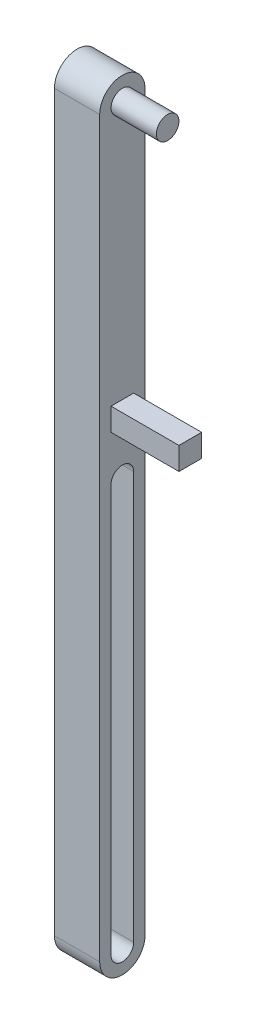
ISO-10303-21;
HEADER;
FILE_DESCRIPTION(('STEP AP214'),'2;1');
FILE_NAME('part.step','',(''),(''),'','','');
FILE_SCHEMA(('AUTOMOTIVE_DESIGN { 1 0 10303 214 1 1 1 1 }'));
ENDSEC;
DATA;
#1=APPLICATION_CONTEXT('core data for automotive mechanical design processes');
#2=APPLICATION_PROTOCOL_DEFINITION('international standard','automotive_design',2000,#1);
#3=PRODUCT_CONTEXT('',#1,'mechanical');
#4=PRODUCT('Part','Part','',(#3));
#5=PRODUCT_RELATED_PRODUCT_CATEGORY('part','',(#4));
#6=PRODUCT_DEFINITION_FORMATION('','',#4);
#7=PRODUCT_DEFINITION_CONTEXT('part definition',#1,'design');
#8=PRODUCT_DEFINITION('design','',#6,#7);
#9=PRODUCT_DEFINITION_SHAPE('','',#8);
#10=(LENGTH_UNIT() NAMED_UNIT(*) SI_UNIT(.MILLI.,.METRE.));
#11=(NAMED_UNIT(*) PLANE_ANGLE_UNIT() SI_UNIT($,.RADIAN.));
#12=(NAMED_UNIT(*) SI_UNIT($,.STERADIAN.) SOLID_ANGLE_UNIT());
#13=UNCERTAINTY_MEASURE_WITH_UNIT(LENGTH_MEASURE(1.E-05),#10,'distance_accuracy_value','');
#14=(GEOMETRIC_REPRESENTATION_CONTEXT(3) GLOBAL_UNCERTAINTY_ASSIGNED_CONTEXT((#13)) GLOBAL_UNIT_ASSIGNED_CONTEXT((#10,
#11,#12)) REPRESENTATION_CONTEXT('',''));
#15=CARTESIAN_POINT('',(0.,0.,0.));
#16=DIRECTION('',(0.,0.,1.));
#17=DIRECTION('',(1.,0.,0.));
#18=AXIS2_PLACEMENT_3D('',#15,#16,#17);
#19=CARTESIAN_POINT('',(-12.,0.,-236.412295168564));
#20=DIRECTION('',(0.,0.,1.));
#21=DIRECTION('',(1.,0.,0.));
#22=AXIS2_PLACEMENT_3D('',#19,#20,#21);
#23=PLANE('',#22);
#24=DIRECTION('',(0.,-1.,0.));
#25=VECTOR('',#24,1.);
#26=CARTESIAN_POINT('',(-3.99999999999999,0.,-236.412295168564));
#27=LINE('',#26,#25);
#28=CARTESIAN_POINT('',(-3.99999999999999,-131.821024249135,-236.412295168564));
#29=VERTEX_POINT('',#28);
#30=CARTESIAN_POINT('',(-3.99999999999999,-261.443240014958,-236.412295168564));
#31=VERTEX_POINT('',#30);
#32=EDGE_CURVE('E159',#29,#31,#27,.T.);
#33=ORIENTED_EDGE('',*,*,#32,.T.);
#34=DIRECTION('',(1.,0.,0.));
#35=VECTOR('',#34,1.);
#36=CARTESIAN_POINT('',(-12.,-261.443240014958,-236.412295168564));
#37=LINE('',#36,#35);
#38=CARTESIAN_POINT('',(-12.,-261.443240014958,-236.412295168564));
#39=VERTEX_POINT('',#38);
#40=EDGE_CURVE('E45',#39,#31,#37,.T.);
#41=ORIENTED_EDGE('',*,*,#40,.F.);
#42=DIRECTION('',(0.,-1.,0.));
#43=VECTOR('',#42,1.);
#44=CARTESIAN_POINT('',(-12.,0.,-236.412295168564));
#45=LINE('',#44,#43);
#46=CARTESIAN_POINT('',(-12.,-131.821024249135,-236.412295168564));
#47=VERTEX_POINT('',#46);
#48=EDGE_CURVE('E126',#47,#39,#45,.T.);
#49=ORIENTED_EDGE('',*,*,#48,.F.);
#50=DIRECTION('',(1.,0.,0.));
#51=VECTOR('',#50,1.);
#52=CARTESIAN_POINT('',(-12.,-131.821024249135,-236.412295168564));
#53=LINE('',#52,#51);
#54=EDGE_CURVE('E61',#47,#29,#53,.T.);
#55=ORIENTED_EDGE('',*,*,#54,.T.);
#56=EDGE_LOOP('',(#33,#41,#49,#55));
#57=FACE_BOUND('',#56,.T.);
#58=ADVANCED_FACE('F37',(#57),#23,.F.);
#59=CARTESIAN_POINT('',(-12.,-261.443240014958,-232.412295168564));
#60=DIRECTION('',(1.,0.,0.));
#61=DIRECTION('',(0.,0.,-1.));
#62=AXIS2_PLACEMENT_3D('',#59,#60,#61);
#63=CYLINDRICAL_SURFACE('',#62,4.);
#64=CARTESIAN_POINT('',(-3.99999999999999,-261.443240014958,-232.412295168564));
#65=DIRECTION('',(-1.,0.,0.));
#66=DIRECTION('',(0.,0.,1.));
#67=AXIS2_PLACEMENT_3D('',#64,#65,#66);
#68=CIRCLE('',#67,4.);
#69=CARTESIAN_POINT('',(-3.99999999999999,-261.443240014958,-228.412295168564));
#70=VERTEX_POINT('',#69);
#71=EDGE_CURVE('E134',#31,#70,#68,.T.);
#72=ORIENTED_EDGE('',*,*,#71,.T.);
#73=DIRECTION('',(1.,0.,0.));
#74=VECTOR('',#73,1.);
#75=CARTESIAN_POINT('',(-12.,-261.443240014958,-228.412295168564));
#76=LINE('',#75,#74);
#77=CARTESIAN_POINT('',(-12.,-261.443240014958,-228.412295168564));
#78=VERTEX_POINT('',#77);
#79=EDGE_CURVE('E132',#78,#70,#76,.T.);
#80=ORIENTED_EDGE('',*,*,#79,.F.);
#81=CARTESIAN_POINT('',(-12.,-261.443240014958,-232.412295168564));
#82=DIRECTION('',(-1.,0.,0.));
#83=DIRECTION('',(0.,0.,1.));
#84=AXIS2_PLACEMENT_3D('',#81,#82,#83);
#85=CIRCLE('',#84,4.);
#86=EDGE_CURVE('E120',#39,#78,#85,.T.);
#87=ORIENTED_EDGE('',*,*,#86,.F.);
#88=ORIENTED_EDGE('',*,*,#40,.T.);
#89=EDGE_LOOP('',(#72,#80,#87,#88));
#90=FACE_BOUND('',#89,.T.);
#91=ADVANCED_FACE('F133',(#90),#63,.T.);
#92=CARTESIAN_POINT('',(-12.,0.,-228.412295168564));
#93=DIRECTION('',(0.,0.,1.));
#94=DIRECTION('',(1.,0.,0.));
#95=AXIS2_PLACEMENT_3D('',#92,#93,#94);
#96=PLANE('',#95);
#97=DIRECTION('',(0.,-1.,0.));
#98=VECTOR('',#97,1.);
#99=CARTESIAN_POINT('',(-3.99999999999999,0.,-228.412295168564));
#100=LINE('',#99,#98);
#101=CARTESIAN_POINT('',(-3.99999999999999,-131.821024249135,-228.412295168564));
#102=VERTEX_POINT('',#101);
#103=EDGE_CURVE('E162',#102,#70,#100,.T.);
#104=ORIENTED_EDGE('',*,*,#103,.F.);
#105=DIRECTION('',(1.,0.,0.));
#106=VECTOR('',#105,1.);
#107=CARTESIAN_POINT('',(-12.,-131.821024249135,-228.412295168564));
#108=LINE('',#107,#106);
#109=CARTESIAN_POINT('',(-12.,-131.821024249135,-228.412295168564));
#110=VERTEX_POINT('',#109);
#111=EDGE_CURVE('E138',#110,#102,#108,.T.);
#112=ORIENTED_EDGE('',*,*,#111,.F.);
#113=DIRECTION('',(0.,-1.,0.));
#114=VECTOR('',#113,1.);
#115=CARTESIAN_POINT('',(-12.,0.,-228.412295168564));
#116=LINE('',#115,#114);
#117=EDGE_CURVE('E125',#110,#78,#116,.T.);
#118=ORIENTED_EDGE('',*,*,#117,.T.);
#119=ORIENTED_EDGE('',*,*,#79,.T.);
#120=EDGE_LOOP('',(#104,#112,#118,#119));
#121=FACE_BOUND('',#120,.T.);
#122=ADVANCED_FACE('F140',(#121),#96,.T.);
#123=CARTESIAN_POINT('',(-12.,-261.443240014958,-232.412295168564));
#124=DIRECTION('',(1.,0.,0.));
#125=DIRECTION('',(0.,0.,-1.));
#126=AXIS2_PLACEMENT_3D('',#123,#124,#125);
#127=CYLINDRICAL_SURFACE('',#126,2.);
#128=CARTESIAN_POINT('',(-3.99999999999999,-261.443240014958,-232.412295168564));
#129=DIRECTION('',(-1.,0.,0.));
#130=DIRECTION('',(0.,0.,1.));
#131=AXIS2_PLACEMENT_3D('',#128,#129,#130);
#132=CIRCLE('',#131,2.);
#133=CARTESIAN_POINT('',(-3.99999999999999,-261.443240014958,-234.412295168564));
#134=VERTEX_POINT('',#133);
#135=CARTESIAN_POINT('',(-3.99999999999999,-261.443240014958,-230.412295168564));
#136=VERTEX_POINT('',#135);
#137=EDGE_CURVE('E147',#134,#136,#132,.T.);
#138=ORIENTED_EDGE('',*,*,#137,.F.);
#139=DIRECTION('',(1.,0.,0.));
#140=VECTOR('',#139,1.);
#141=CARTESIAN_POINT('',(-12.,-261.443240014958,-234.412295168564));
#142=LINE('',#141,#140);
#143=CARTESIAN_POINT('',(-12.,-261.443240014958,-234.412295168564));
#144=VERTEX_POINT('',#143);
#145=EDGE_CURVE('E100',#144,#134,#142,.T.);
#146=ORIENTED_EDGE('',*,*,#145,.F.);
#147=CARTESIAN_POINT('',(-12.,-261.443240014958,-232.412295168564));
#148=DIRECTION('',(-1.,0.,0.));
#149=DIRECTION('',(0.,0.,1.));
#150=AXIS2_PLACEMENT_3D('',#147,#148,#149);
#151=CIRCLE('',#150,2.);
#152=CARTESIAN_POINT('',(-12.,-261.443240014958,-230.412295168564));
#153=VERTEX_POINT('',#152);
#154=EDGE_CURVE('E167',#144,#153,#151,.T.);
#155=ORIENTED_EDGE('',*,*,#154,.T.);
#156=DIRECTION('',(1.,0.,0.));
#157=VECTOR('',#156,1.);
#158=CARTESIAN_POINT('',(-12.,-261.443240014958,-230.412295168564));
#159=LINE('',#158,#157);
#160=EDGE_CURVE('E143',#153,#136,#159,.T.);
#161=ORIENTED_EDGE('',*,*,#160,.T.);
#162=EDGE_LOOP('',(#138,#146,#155,#161));
#163=FACE_BOUND('',#162,.T.);
#164=ADVANCED_FACE('F39',(#163),#127,.F.);
#165=CARTESIAN_POINT('',(-12.,0.,-234.412295168564));
#166=DIRECTION('',(0.,0.,1.));
#167=DIRECTION('',(1.,0.,0.));
#168=AXIS2_PLACEMENT_3D('',#165,#166,#167);
#169=PLANE('',#168);
#170=DIRECTION('',(0.,-1.,0.));
#171=VECTOR('',#170,1.);
#172=CARTESIAN_POINT('',(-3.99999999999999,0.,-234.412295168564));
#173=LINE('',#172,#171);
#174=CARTESIAN_POINT('',(-3.99999999999999,-189.443240014958,-234.412295168564));
#175=VERTEX_POINT('',#174);
#176=EDGE_CURVE('E150',#175,#134,#173,.T.);
#177=ORIENTED_EDGE('',*,*,#176,.F.);
#178=DIRECTION('',(1.,0.,0.));
#179=VECTOR('',#178,1.);
#180=CARTESIAN_POINT('',(-12.,-189.443240014958,-234.412295168564));
#181=LINE('',#180,#179);
#182=CARTESIAN_POINT('',(-12.,-189.443240014958,-234.412295168564));
#183=VERTEX_POINT('',#182);
#184=EDGE_CURVE('E175',#183,#175,#181,.T.);
#185=ORIENTED_EDGE('',*,*,#184,.F.);
#186=DIRECTION('',(0.,-1.,0.));
#187=VECTOR('',#186,1.);
#188=CARTESIAN_POINT('',(-12.,0.,-234.412295168564));
#189=LINE('',#188,#187);
#190=EDGE_CURVE('E181',#183,#144,#189,.T.);
#191=ORIENTED_EDGE('',*,*,#190,.T.);
#192=ORIENTED_EDGE('',*,*,#145,.T.);
#193=EDGE_LOOP('',(#177,#185,#191,#192));
#194=FACE_BOUND('',#193,.T.);
#195=ADVANCED_FACE('F179',(#194),#169,.T.);
#196=CARTESIAN_POINT('',(-12.,-189.443240014958,-232.412295168564));
#197=DIRECTION('',(1.,0.,0.));
#198=DIRECTION('',(0.,0.,-1.));
#199=AXIS2_PLACEMENT_3D('',#196,#197,#198);
#200=CYLINDRICAL_SURFACE('',#199,2.);
#201=CARTESIAN_POINT('',(-3.99999999999999,-189.443240014958,-232.412295168564));
#202=DIRECTION('',(-1.,0.,0.));
#203=DIRECTION('',(0.,0.,1.));
#204=AXIS2_PLACEMENT_3D('',#201,#202,#203);
#205=CIRCLE('',#204,2.);
#206=CARTESIAN_POINT('',(-3.99999999999999,-189.443240014958,-230.412295168564));
#207=VERTEX_POINT('',#206);
#208=EDGE_CURVE('E154',#175,#207,#205,.F.);
#209=ORIENTED_EDGE('',*,*,#208,.T.);
#210=DIRECTION('',(1.,0.,0.));
#211=VECTOR('',#210,1.);
#212=CARTESIAN_POINT('',(-12.,-189.443240014958,-230.412295168564));
#213=LINE('',#212,#211);
#214=CARTESIAN_POINT('',(-12.,-189.443240014958,-230.412295168564));
#215=VERTEX_POINT('',#214);
#216=EDGE_CURVE('E172',#215,#207,#213,.T.);
#217=ORIENTED_EDGE('',*,*,#216,.F.);
#218=CARTESIAN_POINT('',(-12.,-189.443240014958,-232.412295168564));
#219=DIRECTION('',(-1.,0.,0.));
#220=DIRECTION('',(0.,0.,1.));
#221=AXIS2_PLACEMENT_3D('',#218,#219,#220);
#222=CIRCLE('',#221,2.);
#223=EDGE_CURVE('E197',#183,#215,#222,.F.);
#224=ORIENTED_EDGE('',*,*,#223,.F.);
#225=ORIENTED_EDGE('',*,*,#184,.T.);
#226=EDGE_LOOP('',(#209,#217,#224,#225));
#227=FACE_BOUND('',#226,.T.);
#228=ADVANCED_FACE('F190',(#227),#200,.F.);
#229=CARTESIAN_POINT('',(-12.,0.,-230.412295168564));
#230=DIRECTION('',(0.,0.,1.));
#231=DIRECTION('',(1.,0.,0.));
#232=AXIS2_PLACEMENT_3D('',#229,#230,#231);
#233=PLANE('',#232);
#234=DIRECTION('',(0.,-1.,0.));
#235=VECTOR('',#234,1.);
#236=CARTESIAN_POINT('',(-3.99999999999999,0.,-230.412295168564));
#237=LINE('',#236,#235);
#238=EDGE_CURVE('E156',#207,#136,#237,.T.);
#239=ORIENTED_EDGE('',*,*,#238,.T.);
#240=ORIENTED_EDGE('',*,*,#160,.F.);
#241=DIRECTION('',(0.,-1.,0.));
#242=VECTOR('',#241,1.);
#243=CARTESIAN_POINT('',(-12.,0.,-230.412295168564));
#244=LINE('',#243,#242);
#245=EDGE_CURVE('E195',#215,#153,#244,.T.);
#246=ORIENTED_EDGE('',*,*,#245,.F.);
#247=ORIENTED_EDGE('',*,*,#216,.T.);
#248=EDGE_LOOP('',(#239,#240,#246,#247));
#249=FACE_BOUND('',#248,.T.);
#250=ADVANCED_FACE('F194',(#249),#233,.F.);
#251=CARTESIAN_POINT('',(-12.,-131.821024249135,-232.412295168564));
#252=DIRECTION('',(1.,0.,0.));
#253=DIRECTION('',(0.,0.,-1.));
#254=AXIS2_PLACEMENT_3D('',#251,#252,#253);
#255=CYLINDRICAL_SURFACE('',#254,4.);
#256=CARTESIAN_POINT('',(-3.99999999999999,-131.821024249135,-232.412295168564));
#257=DIRECTION('',(-1.,0.,0.));
#258=DIRECTION('',(0.,0.,1.));
#259=AXIS2_PLACEMENT_3D('',#256,#257,#258);
#260=CIRCLE('',#259,4.);
#261=EDGE_CURVE('E164',#29,#102,#260,.F.);
#262=ORIENTED_EDGE('',*,*,#261,.F.);
#263=ORIENTED_EDGE('',*,*,#54,.F.);
#264=CARTESIAN_POINT('',(-12.,-131.821024249135,-232.412295168564));
#265=DIRECTION('',(-1.,0.,0.));
#266=DIRECTION('',(0.,0.,1.));
#267=AXIS2_PLACEMENT_3D('',#264,#265,#266);
#268=CIRCLE('',#267,4.);
#269=EDGE_CURVE('E141',#47,#110,#268,.F.);
#270=ORIENTED_EDGE('',*,*,#269,.T.);
#271=ORIENTED_EDGE('',*,*,#111,.T.);
#272=EDGE_LOOP('',(#262,#263,#270,#271));
#273=FACE_BOUND('',#272,.T.);
#274=ADVANCED_FACE('F286',(#273),#255,.T.);
#275=CARTESIAN_POINT('',(-12.,0.,0.));
#276=DIRECTION('',(-1.,0.,0.));
#277=DIRECTION('',(0.,0.,1.));
#278=AXIS2_PLACEMENT_3D('',#275,#276,#277);
#279=PLANE('',#278);
#280=ORIENTED_EDGE('',*,*,#154,.F.);
#281=ORIENTED_EDGE('',*,*,#190,.F.);
#282=ORIENTED_EDGE('',*,*,#223,.T.);
#283=ORIENTED_EDGE('',*,*,#245,.T.);
#284=EDGE_LOOP('',(#280,#281,#282,#283));
#285=FACE_BOUND('',#284,.T.);
#286=ORIENTED_EDGE('',*,*,#48,.T.);
#287=ORIENTED_EDGE('',*,*,#86,.T.);
#288=ORIENTED_EDGE('',*,*,#117,.F.);
#289=ORIENTED_EDGE('',*,*,#269,.F.);
#290=EDGE_LOOP('',(#286,#287,#288,#289));
#291=FACE_BOUND('',#290,.T.);
#292=ADVANCED_FACE('F122',(#285,#291),#279,.T.);
#293=CARTESIAN_POINT('',(-3.99999999999999,0.,0.));
#294=DIRECTION('',(-1.,0.,0.));
#295=DIRECTION('',(0.,0.,1.));
#296=AXIS2_PLACEMENT_3D('',#293,#294,#295);
#297=PLANE('',#296);
#298=DIRECTION('',(0.,1.,0.));
#299=VECTOR('',#298,1.);
#300=CARTESIAN_POINT('',(-3.99999999999999,-181.443240014958,-230.412295168564));
#301=LINE('',#300,#299);
#302=CARTESIAN_POINT('',(-3.99999999999999,-181.443240014958,-230.412295168564));
#303=VERTEX_POINT('',#302);
#304=CARTESIAN_POINT('',(-3.99999999999999,-177.443240014958,-230.412295168564));
#305=VERTEX_POINT('',#304);
#306=EDGE_CURVE('E222',#303,#305,#301,.T.);
#307=ORIENTED_EDGE('',*,*,#306,.T.);
#308=DIRECTION('',(0.,0.,-1.));
#309=VECTOR('',#308,1.);
#310=CARTESIAN_POINT('',(-3.99999999999999,-177.443240014958,-230.412295168564));
#311=LINE('',#310,#309);
#312=CARTESIAN_POINT('',(-3.99999999999999,-177.443240014958,-234.412295168564));
#313=VERTEX_POINT('',#312);
#314=EDGE_CURVE('E52',#305,#313,#311,.T.);
#315=ORIENTED_EDGE('',*,*,#314,.T.);
#316=DIRECTION('',(0.,1.,0.));
#317=VECTOR('',#316,1.);
#318=CARTESIAN_POINT('',(-3.99999999999999,-181.443240014958,-234.412295168564));
#319=LINE('',#318,#317);
#320=CARTESIAN_POINT('',(-3.99999999999999,-181.443240014958,-234.412295168564));
#321=VERTEX_POINT('',#320);
#322=EDGE_CURVE('E214',#321,#313,#319,.T.);
#323=ORIENTED_EDGE('',*,*,#322,.F.);
#324=DIRECTION('',(0.,0.,-1.));
#325=VECTOR('',#324,1.);
#326=CARTESIAN_POINT('',(-3.99999999999999,-181.443240014958,-230.412295168564));
#327=LINE('',#326,#325);
#328=EDGE_CURVE('E218',#303,#321,#327,.T.);
#329=ORIENTED_EDGE('',*,*,#328,.F.);
#330=EDGE_LOOP('',(#307,#315,#323,#329));
#331=FACE_BOUND('',#330,.T.);
#332=CARTESIAN_POINT('',(-3.99999999999999,-131.821024249135,-232.412295168564));
#333=DIRECTION('',(-1.,0.,0.));
#334=DIRECTION('',(0.,0.,1.));
#335=AXIS2_PLACEMENT_3D('',#332,#333,#334);
#336=CIRCLE('',#335,2.);
#337=CARTESIAN_POINT('',(-3.99999999999999,-131.821024249135,-230.412295168564));
#338=VERTEX_POINT('',#337);
#339=EDGE_CURVE('E11',#338,#338,#336,.F.);
#340=ORIENTED_EDGE('',*,*,#339,.F.);
#341=EDGE_LOOP('',(#340));
#342=FACE_BOUND('',#341,.T.);
#343=ORIENTED_EDGE('',*,*,#137,.T.);
#344=ORIENTED_EDGE('',*,*,#238,.F.);
#345=ORIENTED_EDGE('',*,*,#208,.F.);
#346=ORIENTED_EDGE('',*,*,#176,.T.);
#347=EDGE_LOOP('',(#343,#344,#345,#346));
#348=FACE_BOUND('',#347,.T.);
#349=ORIENTED_EDGE('',*,*,#32,.F.);
#350=ORIENTED_EDGE('',*,*,#261,.T.);
#351=ORIENTED_EDGE('',*,*,#103,.T.);
#352=ORIENTED_EDGE('',*,*,#71,.F.);
#353=EDGE_LOOP('',(#349,#350,#351,#352));
#354=FACE_BOUND('',#353,.T.);
#355=ADVANCED_FACE('F186',(#331,#342,#348,#354),#297,.F.);
#356=CARTESIAN_POINT('',(9.65685424949242,-131.821024249135,-232.412295168564));
#357=DIRECTION('',(-1.,0.,0.));
#358=DIRECTION('',(0.,0.,1.));
#359=AXIS2_PLACEMENT_3D('',#356,#357,#358);
#360=CYLINDRICAL_SURFACE('',#359,2.);
#361=ORIENTED_EDGE('',*,*,#339,.T.);
#362=EDGE_LOOP('',(#361));
#363=FACE_BOUND('',#362,.T.);
#364=CARTESIAN_POINT('',(4.,-131.821024249135,-232.412295168564));
#365=DIRECTION('',(1.,0.,0.));
#366=DIRECTION('',(0.,0.,-1.));
#367=AXIS2_PLACEMENT_3D('',#364,#365,#366);
#368=CIRCLE('',#367,2.);
#369=CARTESIAN_POINT('',(4.,-131.821024249135,-234.412295168564));
#370=VERTEX_POINT('',#369);
#371=EDGE_CURVE('E151',#370,#370,#368,.T.);
#372=ORIENTED_EDGE('',*,*,#371,.F.);
#373=EDGE_LOOP('',(#372));
#374=FACE_BOUND('',#373,.T.);
#375=ADVANCED_FACE('F302',(#363,#374),#360,.T.);
#376=CARTESIAN_POINT('',(4.,0.,0.));
#377=DIRECTION('',(1.,0.,0.));
#378=DIRECTION('',(0.,0.,-1.));
#379=AXIS2_PLACEMENT_3D('',#376,#377,#378);
#380=PLANE('',#379);
#381=ORIENTED_EDGE('',*,*,#371,.T.);
#382=EDGE_LOOP('',(#381));
#383=FACE_BOUND('',#382,.T.);
#384=ADVANCED_FACE('F274',(#383),#380,.T.);
#385=CARTESIAN_POINT('',(8.00000000000001,-179.443240014958,-232.412295168564));
#386=DIRECTION('',(1.,0.,0.));
#387=DIRECTION('',(0.,0.,-1.));
#388=AXIS2_PLACEMENT_3D('',#385,#386,#387);
#389=PLANE('',#388);
#390=DIRECTION('',(0.,1.,0.));
#391=VECTOR('',#390,1.);
#392=CARTESIAN_POINT('',(8.00000000000001,-181.443240014958,-230.412295168564));
#393=LINE('',#392,#391);
#394=CARTESIAN_POINT('',(8.00000000000001,-181.443240014958,-230.412295168564));
#395=VERTEX_POINT('',#394);
#396=CARTESIAN_POINT('',(8.00000000000001,-177.443240014958,-230.412295168564));
#397=VERTEX_POINT('',#396);
#398=EDGE_CURVE('E207',#395,#397,#393,.T.);
#399=ORIENTED_EDGE('',*,*,#398,.F.);
#400=DIRECTION('',(0.,0.,-1.));
#401=VECTOR('',#400,1.);
#402=CARTESIAN_POINT('',(8.00000000000001,-181.443240014958,-230.412295168564));
#403=LINE('',#402,#401);
#404=CARTESIAN_POINT('',(8.00000000000001,-181.443240014958,-234.412295168564));
#405=VERTEX_POINT('',#404);
#406=EDGE_CURVE('E223',#395,#405,#403,.T.);
#407=ORIENTED_EDGE('',*,*,#406,.T.);
#408=DIRECTION('',(0.,1.,0.));
#409=VECTOR('',#408,1.);
#410=CARTESIAN_POINT('',(8.00000000000001,-181.443240014958,-234.412295168564));
#411=LINE('',#410,#409);
#412=CARTESIAN_POINT('',(8.00000000000001,-177.443240014958,-234.412295168564));
#413=VERTEX_POINT('',#412);
#414=EDGE_CURVE('E219',#405,#413,#411,.T.);
#415=ORIENTED_EDGE('',*,*,#414,.T.);
#416=DIRECTION('',(0.,0.,-1.));
#417=VECTOR('',#416,1.);
#418=CARTESIAN_POINT('',(8.00000000000001,-177.443240014958,-230.412295168564));
#419=LINE('',#418,#417);
#420=EDGE_CURVE('E211',#397,#413,#419,.T.);
#421=ORIENTED_EDGE('',*,*,#420,.F.);
#422=EDGE_LOOP('',(#399,#407,#415,#421));
#423=FACE_BOUND('',#422,.T.);
#424=ADVANCED_FACE('F263',(#423),#389,.T.);
#425=CARTESIAN_POINT('',(13.6568542494924,-177.443240014958,-230.412295168564));
#426=DIRECTION('',(0.,1.,0.));
#427=DIRECTION('',(0.,0.,1.));
#428=AXIS2_PLACEMENT_3D('',#425,#426,#427);
#429=PLANE('',#428);
#430=DIRECTION('',(-1.,0.,0.));
#431=VECTOR('',#430,1.);
#432=CARTESIAN_POINT('',(13.6568542494924,-177.443240014958,-230.412295168564));
#433=LINE('',#432,#431);
#434=EDGE_CURVE('E205',#397,#305,#433,.T.);
#435=ORIENTED_EDGE('',*,*,#434,.F.);
#436=ORIENTED_EDGE('',*,*,#420,.T.);
#437=DIRECTION('',(-1.,0.,0.));
#438=VECTOR('',#437,1.);
#439=CARTESIAN_POINT('',(13.6568542494924,-177.443240014958,-234.412295168564));
#440=LINE('',#439,#438);
#441=EDGE_CURVE('E208',#413,#313,#440,.T.);
#442=ORIENTED_EDGE('',*,*,#441,.T.);
#443=ORIENTED_EDGE('',*,*,#314,.F.);
#444=EDGE_LOOP('',(#435,#436,#442,#443));
#445=FACE_BOUND('',#444,.T.);
#446=ADVANCED_FACE('F266',(#445),#429,.T.);
#447=CARTESIAN_POINT('',(13.6568542494924,-181.443240014958,-234.412295168564));
#448=DIRECTION('',(0.,0.,1.));
#449=DIRECTION('',(1.,0.,0.));
#450=AXIS2_PLACEMENT_3D('',#447,#448,#449);
#451=PLANE('',#450);
#452=ORIENTED_EDGE('',*,*,#414,.F.);
#453=DIRECTION('',(-1.,0.,0.));
#454=VECTOR('',#453,1.);
#455=CARTESIAN_POINT('',(13.6568542494924,-181.443240014958,-234.412295168564));
#456=LINE('',#455,#454);
#457=EDGE_CURVE('E210',#405,#321,#456,.T.);
#458=ORIENTED_EDGE('',*,*,#457,.T.);
#459=ORIENTED_EDGE('',*,*,#322,.T.);
#460=ORIENTED_EDGE('',*,*,#441,.F.);
#461=EDGE_LOOP('',(#452,#458,#459,#460));
#462=FACE_BOUND('',#461,.T.);
#463=ADVANCED_FACE('F253',(#462),#451,.F.);
#464=CARTESIAN_POINT('',(13.6568542494924,-181.443240014958,-230.412295168564));
#465=DIRECTION('',(0.,1.,0.));
#466=DIRECTION('',(0.,0.,1.));
#467=AXIS2_PLACEMENT_3D('',#464,#465,#466);
#468=PLANE('',#467);
#469=ORIENTED_EDGE('',*,*,#406,.F.);
#470=DIRECTION('',(-1.,0.,0.));
#471=VECTOR('',#470,1.);
#472=CARTESIAN_POINT('',(13.6568542494924,-181.443240014958,-230.412295168564));
#473=LINE('',#472,#471);
#474=EDGE_CURVE('E215',#395,#303,#473,.T.);
#475=ORIENTED_EDGE('',*,*,#474,.T.);
#476=ORIENTED_EDGE('',*,*,#328,.T.);
#477=ORIENTED_EDGE('',*,*,#457,.F.);
#478=EDGE_LOOP('',(#469,#475,#476,#477));
#479=FACE_BOUND('',#478,.T.);
#480=ADVANCED_FACE('F242',(#479),#468,.F.);
#481=CARTESIAN_POINT('',(13.6568542494924,-181.443240014958,-230.412295168564));
#482=DIRECTION('',(0.,0.,1.));
#483=DIRECTION('',(1.,0.,0.));
#484=AXIS2_PLACEMENT_3D('',#481,#482,#483);
#485=PLANE('',#484);
#486=ORIENTED_EDGE('',*,*,#474,.F.);
#487=ORIENTED_EDGE('',*,*,#398,.T.);
#488=ORIENTED_EDGE('',*,*,#434,.T.);
#489=ORIENTED_EDGE('',*,*,#306,.F.);
#490=EDGE_LOOP('',(#486,#487,#488,#489));
#491=FACE_BOUND('',#490,.T.);
#492=ADVANCED_FACE('F265',(#491),#485,.T.);
#493=CLOSED_SHELL('',(#58,#91,#122,#164,#195,#228,#250,#274,#292,#355,#375,#384,#424,#446,#463,
#480,#492));
#494=MANIFOLD_SOLID_BREP('B2',#493);
#495=ADVANCED_BREP_SHAPE_REPRESENTATION('',(#18,#494),#14);
#496=SHAPE_DEFINITION_REPRESENTATION(#9,#495);
ENDSEC;
END-ISO-10303-21;
